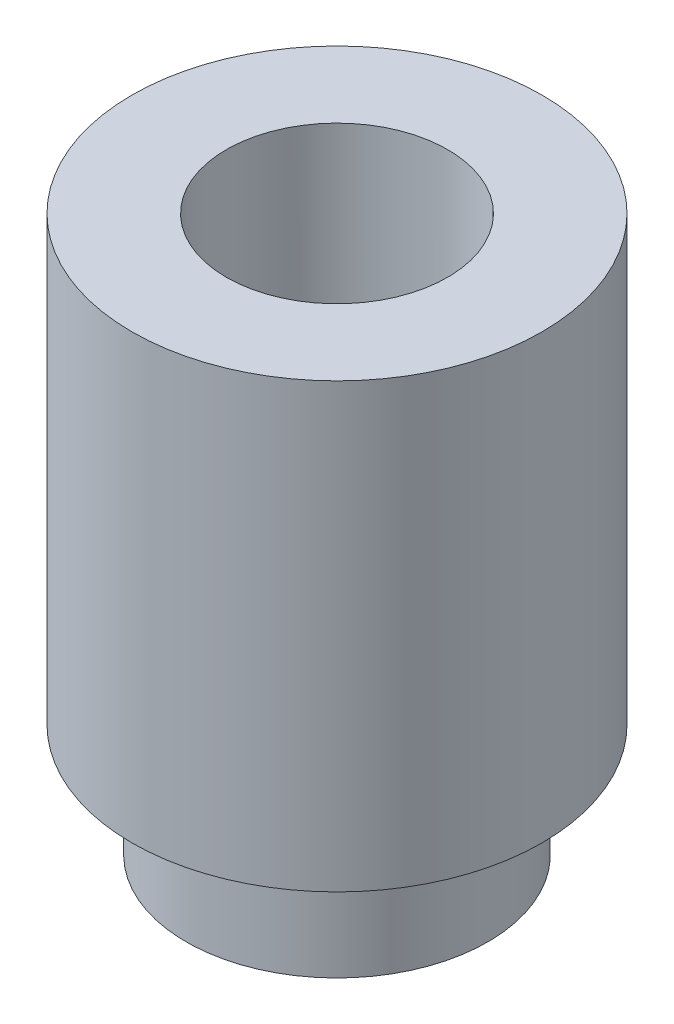
ISO-10303-21;
HEADER;
FILE_DESCRIPTION(('STEP AP214'),'2;1');
FILE_NAME('part.step','',(''),(''),'','','');
FILE_SCHEMA(('AUTOMOTIVE_DESIGN { 1 0 10303 214 1 1 1 1 }'));
ENDSEC;
DATA;
#1=APPLICATION_CONTEXT('core data for automotive mechanical design processes');
#2=APPLICATION_PROTOCOL_DEFINITION('international standard','automotive_design',2000,#1);
#3=PRODUCT_CONTEXT('',#1,'mechanical');
#4=PRODUCT('Part','Part','',(#3));
#5=PRODUCT_RELATED_PRODUCT_CATEGORY('part','',(#4));
#6=PRODUCT_DEFINITION_FORMATION('','',#4);
#7=PRODUCT_DEFINITION_CONTEXT('part definition',#1,'design');
#8=PRODUCT_DEFINITION('design','',#6,#7);
#9=PRODUCT_DEFINITION_SHAPE('','',#8);
#10=(LENGTH_UNIT() NAMED_UNIT(*) SI_UNIT(.MILLI.,.METRE.));
#11=(NAMED_UNIT(*) PLANE_ANGLE_UNIT() SI_UNIT($,.RADIAN.));
#12=(NAMED_UNIT(*) SI_UNIT($,.STERADIAN.) SOLID_ANGLE_UNIT());
#13=UNCERTAINTY_MEASURE_WITH_UNIT(LENGTH_MEASURE(1.E-05),#10,'distance_accuracy_value','');
#14=(GEOMETRIC_REPRESENTATION_CONTEXT(3) GLOBAL_UNCERTAINTY_ASSIGNED_CONTEXT((#13)) GLOBAL_UNIT_ASSIGNED_CONTEXT((#10,
#11,#12)) REPRESENTATION_CONTEXT('',''));
#15=CARTESIAN_POINT('',(0.,0.,0.));
#16=DIRECTION('',(0.,0.,1.));
#17=DIRECTION('',(1.,0.,0.));
#18=AXIS2_PLACEMENT_3D('',#15,#16,#17);
#19=CARTESIAN_POINT('',(0.,6.,0.));
#20=DIRECTION('',(0.,-1.,0.));
#21=DIRECTION('',(0.,0.,-1.));
#22=AXIS2_PLACEMENT_3D('',#19,#20,#21);
#23=CYLINDRICAL_SURFACE('',#22,2.78);
#24=CARTESIAN_POINT('',(0.,6.,0.));
#25=DIRECTION('',(0.,1.,0.));
#26=DIRECTION('',(0.,0.,1.));
#27=AXIS2_PLACEMENT_3D('',#24,#25,#26);
#28=CIRCLE('',#27,2.78);
#29=CARTESIAN_POINT('',(0.,6.,2.78));
#30=VERTEX_POINT('',#29);
#31=EDGE_CURVE('E40',#30,#30,#28,.T.);
#32=ORIENTED_EDGE('',*,*,#31,.F.);
#33=EDGE_LOOP('',(#32));
#34=FACE_BOUND('',#33,.T.);
#35=CARTESIAN_POINT('',(0.,0.,0.));
#36=DIRECTION('',(0.,1.,0.));
#37=DIRECTION('',(0.,0.,1.));
#38=AXIS2_PLACEMENT_3D('',#35,#36,#37);
#39=CIRCLE('',#38,2.78);
#40=CARTESIAN_POINT('',(0.,0.,2.78));
#41=VERTEX_POINT('',#40);
#42=EDGE_CURVE('E36',#41,#41,#39,.T.);
#43=ORIENTED_EDGE('',*,*,#42,.T.);
#44=EDGE_LOOP('',(#43));
#45=FACE_BOUND('',#44,.T.);
#46=ADVANCED_FACE('F33',(#34,#45),#23,.T.);
#47=CARTESIAN_POINT('',(0.,6.,0.));
#48=DIRECTION('',(0.,1.,0.));
#49=DIRECTION('',(0.,0.,1.));
#50=AXIS2_PLACEMENT_3D('',#47,#48,#49);
#51=PLANE('',#50);
#52=CARTESIAN_POINT('',(0.,6.,0.));
#53=DIRECTION('',(0.,1.,0.));
#54=DIRECTION('',(0.,0.,1.));
#55=AXIS2_PLACEMENT_3D('',#52,#53,#54);
#56=CIRCLE('',#55,1.5);
#57=CARTESIAN_POINT('',(0.,6.,1.5));
#58=VERTEX_POINT('',#57);
#59=EDGE_CURVE('E49',#58,#58,#56,.T.);
#60=ORIENTED_EDGE('',*,*,#59,.F.);
#61=EDGE_LOOP('',(#60));
#62=FACE_BOUND('',#61,.T.);
#63=ORIENTED_EDGE('',*,*,#31,.T.);
#64=EDGE_LOOP('',(#63));
#65=FACE_BOUND('',#64,.T.);
#66=ADVANCED_FACE('F58',(#62,#65),#51,.T.);
#67=CARTESIAN_POINT('',(0.,0.,0.));
#68=DIRECTION('',(0.,1.,0.));
#69=DIRECTION('',(0.,0.,1.));
#70=AXIS2_PLACEMENT_3D('',#67,#68,#69);
#71=PLANE('',#70);
#72=CARTESIAN_POINT('',(0.,0.,0.));
#73=DIRECTION('',(0.,-1.,0.));
#74=DIRECTION('',(0.,0.,-1.));
#75=AXIS2_PLACEMENT_3D('',#72,#73,#74);
#76=CIRCLE('',#75,2.045);
#77=CARTESIAN_POINT('',(0.,0.,-2.045));
#78=VERTEX_POINT('',#77);
#79=EDGE_CURVE('E10',#78,#78,#76,.T.);
#80=ORIENTED_EDGE('',*,*,#79,.F.);
#81=EDGE_LOOP('',(#80));
#82=FACE_BOUND('',#81,.T.);
#83=ORIENTED_EDGE('',*,*,#42,.F.);
#84=EDGE_LOOP('',(#83));
#85=FACE_BOUND('',#84,.T.);
#86=ADVANCED_FACE('F61',(#82,#85),#71,.F.);
#87=CARTESIAN_POINT('',(0.,-1.53,0.));
#88=DIRECTION('',(0.,1.,0.));
#89=DIRECTION('',(0.,0.,1.));
#90=AXIS2_PLACEMENT_3D('',#87,#88,#89);
#91=CYLINDRICAL_SURFACE('',#90,2.045);
#92=CARTESIAN_POINT('',(0.,-1.53,0.));
#93=DIRECTION('',(0.,-1.,0.));
#94=DIRECTION('',(0.,0.,-1.));
#95=AXIS2_PLACEMENT_3D('',#92,#93,#94);
#96=CIRCLE('',#95,2.045);
#97=CARTESIAN_POINT('',(0.,-1.53,-2.045));
#98=VERTEX_POINT('',#97);
#99=EDGE_CURVE('E46',#98,#98,#96,.T.);
#100=ORIENTED_EDGE('',*,*,#99,.F.);
#101=EDGE_LOOP('',(#100));
#102=FACE_BOUND('',#101,.T.);
#103=ORIENTED_EDGE('',*,*,#79,.T.);
#104=EDGE_LOOP('',(#103));
#105=FACE_BOUND('',#104,.T.);
#106=ADVANCED_FACE('F71',(#102,#105),#91,.T.);
#107=CARTESIAN_POINT('',(0.,-1.53,0.));
#108=DIRECTION('',(0.,-1.,0.));
#109=DIRECTION('',(0.,0.,-1.));
#110=AXIS2_PLACEMENT_3D('',#107,#108,#109);
#111=PLANE('',#110);
#112=CARTESIAN_POINT('',(0.,-1.53,0.));
#113=DIRECTION('',(0.,-1.,0.));
#114=DIRECTION('',(0.,0.,-1.));
#115=AXIS2_PLACEMENT_3D('',#112,#113,#114);
#116=CIRCLE('',#115,1.5);
#117=CARTESIAN_POINT('',(0.,-1.53,-1.5));
#118=VERTEX_POINT('',#117);
#119=EDGE_CURVE('E50',#118,#118,#116,.F.);
#120=ORIENTED_EDGE('',*,*,#119,.T.);
#121=EDGE_LOOP('',(#120));
#122=FACE_BOUND('',#121,.T.);
#123=ORIENTED_EDGE('',*,*,#99,.T.);
#124=EDGE_LOOP('',(#123));
#125=FACE_BOUND('',#124,.T.);
#126=ADVANCED_FACE('F76',(#122,#125),#111,.T.);
#127=CARTESIAN_POINT('',(0.,-1.531,0.));
#128=DIRECTION('',(0.,1.,0.));
#129=DIRECTION('',(0.,0.,1.));
#130=AXIS2_PLACEMENT_3D('',#127,#128,#129);
#131=CYLINDRICAL_SURFACE('',#130,1.5);
#132=ORIENTED_EDGE('',*,*,#119,.F.);
#133=EDGE_LOOP('',(#132));
#134=FACE_BOUND('',#133,.T.);
#135=ORIENTED_EDGE('',*,*,#59,.T.);
#136=EDGE_LOOP('',(#135));
#137=FACE_BOUND('',#136,.T.);
#138=ADVANCED_FACE('F56',(#134,#137),#131,.F.);
#139=CLOSED_SHELL('',(#46,#66,#86,#106,#126,#138));
#140=MANIFOLD_SOLID_BREP('B2',#139);
#141=ADVANCED_BREP_SHAPE_REPRESENTATION('',(#18,#140),#14);
#142=SHAPE_DEFINITION_REPRESENTATION(#9,#141);
ENDSEC;
END-ISO-10303-21;
